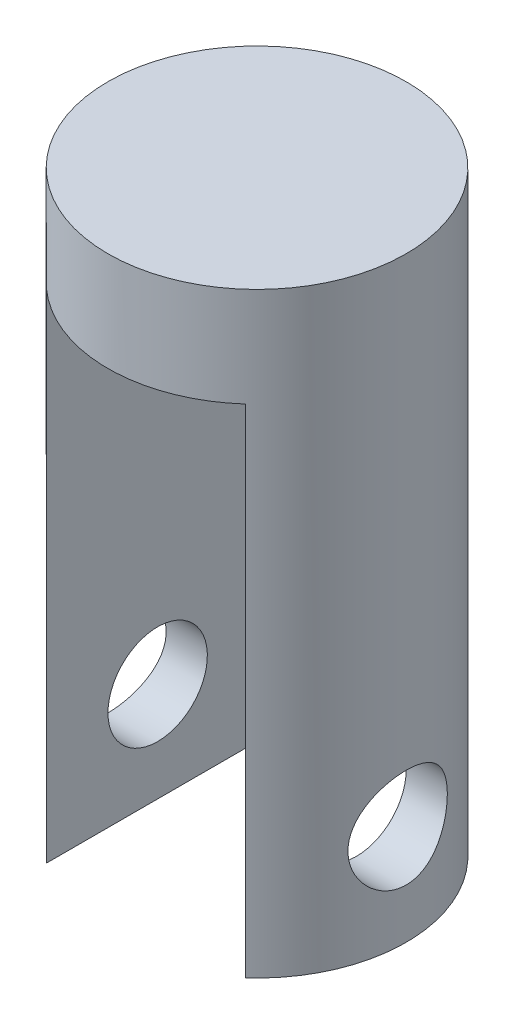
ISO-10303-21;
HEADER;
FILE_DESCRIPTION(('STEP AP214'),'2;1');
FILE_NAME('part.step','',(''),(''),'','','');
FILE_SCHEMA(('AUTOMOTIVE_DESIGN { 1 0 10303 214 1 1 1 1 }'));
ENDSEC;
DATA;
#1=APPLICATION_CONTEXT('core data for automotive mechanical design processes');
#2=APPLICATION_PROTOCOL_DEFINITION('international standard','automotive_design',2000,#1);
#3=PRODUCT_CONTEXT('',#1,'mechanical');
#4=PRODUCT('Part','Part','',(#3));
#5=PRODUCT_RELATED_PRODUCT_CATEGORY('part','',(#4));
#6=PRODUCT_DEFINITION_FORMATION('','',#4);
#7=PRODUCT_DEFINITION_CONTEXT('part definition',#1,'design');
#8=PRODUCT_DEFINITION('design','',#6,#7);
#9=PRODUCT_DEFINITION_SHAPE('','',#8);
#10=(LENGTH_UNIT() NAMED_UNIT(*) SI_UNIT(.MILLI.,.METRE.));
#11=(NAMED_UNIT(*) PLANE_ANGLE_UNIT() SI_UNIT($,.RADIAN.));
#12=(NAMED_UNIT(*) SI_UNIT($,.STERADIAN.) SOLID_ANGLE_UNIT());
#13=UNCERTAINTY_MEASURE_WITH_UNIT(LENGTH_MEASURE(1.E-05),#10,'distance_accuracy_value','');
#14=(GEOMETRIC_REPRESENTATION_CONTEXT(3) GLOBAL_UNCERTAINTY_ASSIGNED_CONTEXT((#13)) GLOBAL_UNIT_ASSIGNED_CONTEXT((#10,
#11,#12)) REPRESENTATION_CONTEXT('',''));
#15=CARTESIAN_POINT('',(0.,0.,0.));
#16=DIRECTION('',(0.,0.,1.));
#17=DIRECTION('',(1.,0.,0.));
#18=AXIS2_PLACEMENT_3D('',#15,#16,#17);
#19=CARTESIAN_POINT('',(0.,-50.,0.));
#20=DIRECTION('',(0.,1.,0.));
#21=DIRECTION('',(0.,0.,1.));
#22=AXIS2_PLACEMENT_3D('',#19,#20,#21);
#23=PLANE('',#22);
#24=CARTESIAN_POINT('',(0.,-50.,0.));
#25=DIRECTION('',(0.,1.,0.));
#26=DIRECTION('',(0.,0.,1.));
#27=AXIS2_PLACEMENT_3D('',#24,#25,#26);
#28=CIRCLE('',#27,15.);
#29=CARTESIAN_POINT('',(-10.,-50.,-11.180339887499));
#30=VERTEX_POINT('',#29);
#31=CARTESIAN_POINT('',(-10.,-50.,11.1803398874989));
#32=VERTEX_POINT('',#31);
#33=EDGE_CURVE('E115',#30,#32,#28,.T.);
#34=ORIENTED_EDGE('',*,*,#33,.F.);
#35=DIRECTION('',(0.,0.,1.));
#36=VECTOR('',#35,1.);
#37=CARTESIAN_POINT('',(-10.,-50.,0.));
#38=LINE('',#37,#36);
#39=EDGE_CURVE('E123',#30,#32,#38,.T.);
#40=ORIENTED_EDGE('',*,*,#39,.T.);
#41=EDGE_LOOP('',(#34,#40));
#42=FACE_BOUND('',#41,.T.);
#43=ADVANCED_FACE('F51',(#42),#23,.F.);
#44=CARTESIAN_POINT('',(0.,10.,0.));
#45=DIRECTION('',(0.,-1.,0.));
#46=DIRECTION('',(0.,0.,-1.));
#47=AXIS2_PLACEMENT_3D('',#44,#45,#46);
#48=CYLINDRICAL_SURFACE('',#47,15.);
#49=CARTESIAN_POINT('',(-15.,-45.,0.));
#50=CARTESIAN_POINT('',(-15.0000007650471,-45.0000012686582,-0.272816814433608));
#51=CARTESIAN_POINT('',(-14.9924884753769,-44.977598669364,-0.545625972692719));
#52=CARTESIAN_POINT('',(-14.9632605101644,-44.8888544559139,-1.08320880436489));
#53=CARTESIAN_POINT('',(-14.941543360109,-44.8225082802552,-1.3479816405942));
#54=CARTESIAN_POINT('',(-14.8862653953208,-44.6484037830799,-1.86166394750877));
#55=CARTESIAN_POINT('',(-14.8527243865377,-44.5407146877042,-2.11059912942976));
#56=CARTESIAN_POINT('',(-14.7772222858721,-44.2872941358077,-2.58687468402704));
#57=CARTESIAN_POINT('',(-14.7352595334076,-44.1415551749849,-2.81421078479507));
#58=CARTESIAN_POINT('',(-14.6457047221309,-43.8108709757084,-3.24870837510974));
#59=CARTESIAN_POINT('',(-14.5979778231161,-43.6248438287057,-3.45501850148552));
#60=CARTESIAN_POINT('',(-14.5030157392292,-43.221164226459,-3.83416346351645));
#61=CARTESIAN_POINT('',(-14.4557806648007,-43.0035048253269,-4.00699092746984));
#62=CARTESIAN_POINT('',(-14.3656666235818,-42.5350744240449,-4.31912471111899));
#63=CARTESIAN_POINT('',(-14.3229519627198,-42.2835313014492,-4.45732429102252));
#64=CARTESIAN_POINT('',(-14.2487652698844,-41.7591195278211,-4.68909436930558));
#65=CARTESIAN_POINT('',(-14.2172898077928,-41.4862574142214,-4.78267848691248));
#66=CARTESIAN_POINT('',(-14.1705651637056,-40.9366338924888,-4.91936730756489));
#67=CARTESIAN_POINT('',(-14.1548047884338,-40.6603139575403,-4.96406724136037));
#68=CARTESIAN_POINT('',(-14.1397828315221,-40.103681229235,-5.00670561667088));
#69=CARTESIAN_POINT('',(-14.1405161515599,-39.8233696964841,-5.00465850803659));
#70=CARTESIAN_POINT('',(-14.1579507500054,-39.2803168477389,-4.95509951850357));
#71=CARTESIAN_POINT('',(-14.1739207918415,-39.0173579852815,-4.90966956578089));
#72=CARTESIAN_POINT('',(-14.2188328846856,-38.5030329018494,-4.77803081419368));
#73=CARTESIAN_POINT('',(-14.2477764887883,-38.2516680727977,-4.6918171329474));
#74=CARTESIAN_POINT('',(-14.3158955569848,-37.7629362520803,-4.4796952903177));
#75=CARTESIAN_POINT('',(-14.3552282897692,-37.5258598726625,-4.35317024354079));
#76=CARTESIAN_POINT('',(-14.4396279286729,-37.0756454585912,-4.06444553151124));
#77=CARTESIAN_POINT('',(-14.4846964894921,-36.8625143653303,-3.90223556181881));
#78=CARTESIAN_POINT('',(-14.5783664584198,-36.4545420091991,-3.53674666341248));
#79=CARTESIAN_POINT('',(-14.6270294677509,-36.2612365274554,-3.33176575038191));
#80=CARTESIAN_POINT('',(-14.7203469193431,-35.9113436666822,-2.89169784984998));
#81=CARTESIAN_POINT('',(-14.765000976901,-35.7547598091773,-2.65660797830399));
#82=CARTESIAN_POINT('',(-14.8458553968921,-35.4815184988249,-2.15973806523145));
#83=CARTESIAN_POINT('',(-14.8819675004026,-35.3652725432964,-1.89771638208172));
#84=CARTESIAN_POINT('',(-14.9410283572211,-35.1789841302214,-1.35634541682253));
#85=CARTESIAN_POINT('',(-14.9639816827438,-35.1089256228828,-1.07700219077478));
#86=CARTESIAN_POINT('',(-14.9933813535722,-35.0197216698882,-0.52191914764654));
#87=CARTESIAN_POINT('',(-15.0005000916864,-34.9985009541362,-0.246547999324246));
#88=CARTESIAN_POINT('',(-14.9994451347413,-35.0016633679923,0.303875349801176));
#89=CARTESIAN_POINT('',(-14.9912740209681,-35.0260387998994,0.57892759659824));
#90=CARTESIAN_POINT('',(-14.9610012358552,-35.1180595386798,1.11259933152126));
#91=CARTESIAN_POINT('',(-14.9393099355596,-35.1844310302475,1.3714640341742));
#92=CARTESIAN_POINT('',(-14.8845923415035,-35.3569672223336,1.87427979289785));
#93=CARTESIAN_POINT('',(-14.8515646023338,-35.4631369973389,2.11822894254302));
#94=CARTESIAN_POINT('',(-14.7764465643645,-35.7153521592039,2.59144148196635));
#95=CARTESIAN_POINT('',(-14.7341407377893,-35.8623729664159,2.82014979608572));
#96=CARTESIAN_POINT('',(-14.6452626958131,-36.1909707500674,3.25032415067792));
#97=CARTESIAN_POINT('',(-14.5986891796914,-36.3725582801588,3.45178183897787));
#98=CARTESIAN_POINT('',(-14.5038423990222,-36.7748937550329,3.83126253903149));
#99=CARTESIAN_POINT('',(-14.4555880543714,-36.9970461346343,4.00780484622885));
#100=CARTESIAN_POINT('',(-14.3649986647354,-37.4688578390544,4.32128761161787));
#101=CARTESIAN_POINT('',(-14.3226636691001,-37.7185173931704,4.45822773965506));
#102=CARTESIAN_POINT('',(-14.2491195895692,-38.2383650764495,4.6879846520818));
#103=CARTESIAN_POINT('',(-14.2178880396489,-38.5085103958438,4.7808906608251));
#104=CARTESIAN_POINT('',(-14.1705416153225,-39.0618932502206,4.91947333379677));
#105=CARTESIAN_POINT('',(-14.154419931182,-39.3451248270217,4.96517127476969));
#106=CARTESIAN_POINT('',(-14.1398929437089,-39.9009854802046,5.0063814123867));
#107=CARTESIAN_POINT('',(-14.1406200128708,-40.1734117014341,5.00435128654199));
#108=CARTESIAN_POINT('',(-14.1575634911934,-40.7138253746103,4.95621146724346));
#109=CARTESIAN_POINT('',(-14.1737789784681,-40.9818130897754,4.91010439729292));
#110=CARTESIAN_POINT('',(-14.2192262152446,-41.5006783150124,4.77685906564672));
#111=CARTESIAN_POINT('',(-14.2482049011239,-41.7517841250225,4.69051673007757));
#112=CARTESIAN_POINT('',(-14.3158199409234,-42.2361370346913,4.47989682879873));
#113=CARTESIAN_POINT('',(-14.3544584381697,-42.46938015594,4.35561084276903));
#114=CARTESIAN_POINT('',(-14.4391414613023,-42.9224183496146,4.06630346291715));
#115=CARTESIAN_POINT('',(-14.4854355821069,-43.1411825094919,3.8997412138229));
#116=CARTESIAN_POINT('',(-14.5791678141626,-43.548449066921,3.53321441567824));
#117=CARTESIAN_POINT('',(-14.6266062456186,-43.7369428784404,3.33324042225741));
#118=CARTESIAN_POINT('',(-14.7195015262772,-44.0857220614459,2.89620778460344));
#119=CARTESIAN_POINT('',(-14.7648090900628,-44.244621738755,2.65800756749864));
#120=CARTESIAN_POINT('',(-14.8462995586306,-44.5199521442532,2.15678678703313));
#121=CARTESIAN_POINT('',(-14.8824847953965,-44.6363937296102,1.89377259066175));
#122=CARTESIAN_POINT('',(-14.9402757534271,-44.8186081624434,1.36246823600488));
#123=CARTESIAN_POINT('',(-14.9624606211261,-44.8864123313169,1.09493878838205));
#124=CARTESIAN_POINT('',(-14.9923203532111,-44.9771014033856,0.551602080051236));
#125=CARTESIAN_POINT('',(-14.9999992265953,-44.9999987174827,0.275797127843725));
#126=CARTESIAN_POINT('',(-15.,-45.,0.));
#127=B_SPLINE_CURVE_WITH_KNOTS('',3,(#49,#50,#51,#52,#53,#54,#55,#56,#57,#58,#59,#60,#61,#62,
#63,#64,#65,#66,#67,#68,#69,#70,#71,#72,#73,#74,#75,#76,#77,#78,#79,#80,#81,#82,#83,#84,#85,#86,
#87,#88,#89,#90,#91,#92,#93,#94,#95,#96,#97,#98,#99,#100,#101,#102,#103,#104,#105,#106,#107,
#108,#109,#110,#111,#112,#113,#114,#115,#116,#117,#118,#119,#120,#121,#122,#123,#124,#125,#126),
.UNSPECIFIED.,.T.,.F.,(4,2,2,2,2,2,2,2,2,2,2,2,2,2,2,2,2,2,2,2,2,2,2,2,2,2,2,2,2,2,2,2,2,2,2,2,
2,2,4),(0.,0.817435530130053,1.6349559263376,2.45111336435137,3.2674318889955,4.10923421413779,
4.95122166437651,5.8174192411892,6.6833522346775,7.52009628712783,8.3565816994101,
9.15484132763712,9.95319654288061,10.764408557863,11.5758551280169,12.4296652906749,
13.2835572984374,14.1459202826244,15.0079834439669,15.832679158865,16.6572356583153,
17.4579078990172,18.2586822643117,19.0805199922933,19.9026090412011,20.7620511441441,
21.6215004118563,22.479200691445,23.3365142353985,24.1497833033194,24.9630039676753,
25.7607793541274,26.5587319089054,27.3915033346967,28.2245105562954,29.0899830418615,
29.9552340577293,30.7818279187972,31.6081933020135),.UNSPECIFIED.);
#128=CARTESIAN_POINT('',(-15.,-45.,0.));
#129=VERTEX_POINT('',#128);
#130=EDGE_CURVE('E101',#129,#129,#127,.T.);
#131=ORIENTED_EDGE('',*,*,#130,.T.);
#132=EDGE_LOOP('',(#131));
#133=FACE_BOUND('',#132,.T.);
#134=CARTESIAN_POINT('',(14.142135623731,-40.,-5.00000000000001));
#135=CARTESIAN_POINT('',(14.1421347265217,-40.2723408741804,-5.00000128973857));
#136=CARTESIAN_POINT('',(14.1500884645429,-40.544673999118,-4.97767391842762));
#137=CARTESIAN_POINT('',(14.1808787040627,-41.0812721049712,-4.88925565844405));
#138=CARTESIAN_POINT('',(14.2037176571094,-41.3455357493623,-4.82315756084199));
#139=CARTESIAN_POINT('',(14.2614101844396,-41.8581344649864,-4.64977742842453));
#140=CARTESIAN_POINT('',(14.2962401985661,-42.1064996472136,-4.54257610701623));
#141=CARTESIAN_POINT('',(14.3739561005162,-42.5818002427398,-4.29030814220691));
#142=CARTESIAN_POINT('',(14.4168437651806,-42.8087309127682,-4.14523314430092));
#143=CARTESIAN_POINT('',(14.5077244703737,-43.2435998116916,-3.8152557322144));
#144=CARTESIAN_POINT('',(14.5558447422322,-43.4505771433586,-3.62912170688961));
#145=CARTESIAN_POINT('',(14.6506932400501,-43.8310340061232,-3.22493833607199));
#146=CARTESIAN_POINT('',(14.6974212414481,-44.0045081579119,-3.00688387526189));
#147=CARTESIAN_POINT('',(14.7856933460899,-44.317394486648,-2.53802253982506));
#148=CARTESIAN_POINT('',(14.8270703850803,-44.4557998530898,-2.28650955612264));
#149=CARTESIAN_POINT('',(14.8984793385491,-44.6879579256376,-1.76215611493738));
#150=CARTESIAN_POINT('',(14.9285143101501,-44.7817226658845,-1.48932142843607));
#151=CARTESIAN_POINT('',(14.9729537715953,-44.918679273162,-0.940144087167483));
#152=CARTESIAN_POINT('',(14.987865738878,-44.963517231285,-0.664253774264854));
#153=CARTESIAN_POINT('',(15.0021804109124,-45.0065814668033,-0.108489374120458));
#154=CARTESIAN_POINT('',(15.0015871131448,-45.0048197582621,0.171383667719471));
#155=CARTESIAN_POINT('',(14.9853019809366,-44.9557787271699,0.715517575969064));
#156=CARTESIAN_POINT('',(14.9702032377559,-44.9102873576276,0.979960242958274));
#157=CARTESIAN_POINT('',(14.9273483669866,-44.7780350950976,1.49721719411085));
#158=CARTESIAN_POINT('',(14.8995913815591,-44.6912714051009,1.75003068889607));
#159=CARTESIAN_POINT('',(14.8337835146612,-44.4778934134697,2.24076237420985));
#160=CARTESIAN_POINT('',(14.7956021262008,-44.3507703072674,2.47844110484422));
#161=CARTESIAN_POINT('',(14.712919651946,-44.0607014727567,2.9296216276366));
#162=CARTESIAN_POINT('',(14.6684168100733,-43.8977457833618,3.1431166719267));
#163=CARTESIAN_POINT('',(14.5753095924948,-43.5316280327015,3.55050433275653));
#164=CARTESIAN_POINT('',(14.5266107584439,-43.3269342107926,3.74300078532635));
#165=CARTESIAN_POINT('',(14.432366762445,-42.8877563713669,4.09138629799086));
#166=CARTESIAN_POINT('',(14.3868220872808,-42.6532677713598,4.24726971640771));
#167=CARTESIAN_POINT('',(14.3035262560556,-42.1567318719828,4.51993727517871));
#168=CARTESIAN_POINT('',(14.2658954642374,-41.8943393434111,4.63613231810669));
#169=CARTESIAN_POINT('',(14.2040825412192,-41.3521430289279,4.82221596634668));
#170=CARTESIAN_POINT('',(14.1798947743546,-41.0723465939688,4.89212397873746));
#171=CARTESIAN_POINT('',(14.1489818157793,-40.5168082229421,4.9808064104876));
#172=CARTESIAN_POINT('',(14.1415180159378,-40.2414528762567,5.00174547753816));
#173=CARTESIAN_POINT('',(14.1428336029592,-39.6911192544295,4.99802719454859));
#174=CARTESIAN_POINT('',(14.1516100395907,-39.4161409198801,4.97337812613381));
#175=CARTESIAN_POINT('',(14.183680904515,-38.8842151714405,4.88112825776155));
#176=CARTESIAN_POINT('',(14.206466272042,-38.6269728492458,4.81503196990341));
#177=CARTESIAN_POINT('',(14.2634276835512,-38.1272819688041,4.64356931280233));
#178=CARTESIAN_POINT('',(14.297605746742,-37.8848360420461,4.53819598181711));
#179=CARTESIAN_POINT('',(14.3748438797893,-37.413097895765,4.28737170369468));
#180=CARTESIAN_POINT('',(14.4181512832814,-37.184466786791,4.14075559179248));
#181=CARTESIAN_POINT('',(14.5082884365483,-36.7542697380814,3.81292815278779));
#182=CARTESIAN_POINT('',(14.5551192221897,-36.5527118066939,3.63170662749391));
#183=CARTESIAN_POINT('',(14.6497519318925,-36.1723600795468,3.22945852950163));
#184=CARTESIAN_POINT('',(14.6974921788948,-35.9951280499058,3.00693635273326));
#185=CARTESIAN_POINT('',(14.7863425806554,-35.6804192882598,2.53413645700128));
#186=CARTESIAN_POINT('',(14.8274529708847,-35.5429411441879,2.28385972432276));
#187=CARTESIAN_POINT('',(14.8982202905301,-35.3128994756914,1.76389931216148));
#188=CARTESIAN_POINT('',(14.9279515002266,-35.2200436142597,1.49435561660598));
#189=CARTESIAN_POINT('',(14.9729305418887,-35.0813612896995,0.942292329230082));
#190=CARTESIAN_POINT('',(14.9881836017009,-35.0355178505975,0.659777459769448));
#191=CARTESIAN_POINT('',(15.0020931618128,-34.9936896119718,0.104076679300205));
#192=CARTESIAN_POINT('',(15.001496004472,-34.9954627303381,-0.168923619600093));
#193=CARTESIAN_POINT('',(14.9856098259699,-35.043286540732,-0.710555725000871));
#194=CARTESIAN_POINT('',(14.9703219966788,-35.0893336407638,-0.979187884095286));
#195=CARTESIAN_POINT('',(14.9270457477206,-35.2229111728798,-1.5002105971603));
#196=CARTESIAN_POINT('',(14.8992629180574,-35.3097710767647,-1.75279135456395));
#197=CARTESIAN_POINT('',(14.8338580352247,-35.5218876554858,-2.23989175469898));
#198=CARTESIAN_POINT('',(14.7962342024008,-35.6471512759851,-2.47440812071216));
#199=CARTESIAN_POINT('',(14.713293441394,-35.93784756051,-2.92817008154393));
#200=CARTESIAN_POINT('',(14.6677436245963,-36.1045934269082,-3.14653125778804));
#201=CARTESIAN_POINT('',(14.574649439594,-36.471286955781,-3.55290513136214));
#202=CARTESIAN_POINT('',(14.5271044386549,-36.6712452113136,-3.74090810812297));
#203=CARTESIAN_POINT('',(14.4331639912799,-37.1080467779347,-4.08870904416559));
#204=CARTESIAN_POINT('',(14.3868863994315,-37.3460275548832,-4.24711482998951));
#205=CARTESIAN_POINT('',(14.3030096661508,-37.8466721345139,-4.52157171650558));
#206=CARTESIAN_POINT('',(14.2654082580625,-38.1093294651483,-4.63763388409738));
#207=CARTESIAN_POINT('',(14.2050667103257,-38.6398091200782,-4.81921914102083));
#208=CARTESIAN_POINT('',(14.1817316428591,-38.9068613176268,-4.8867895457476));
#209=CARTESIAN_POINT('',(14.1502691769759,-39.4492802523335,-4.97717160074634));
#210=CARTESIAN_POINT('',(14.1421365308731,-39.7246440870535,-4.99999869598297));
#211=CARTESIAN_POINT('',(14.142135623731,-40.,-5.00000000000001));
#212=B_SPLINE_CURVE_WITH_KNOTS('',3,(#134,#135,#136,#137,#138,#139,#140,#141,#142,#143,#144,
#145,#146,#147,#148,#149,#150,#151,#152,#153,#154,#155,#156,#157,#158,#159,#160,#161,#162,#163,
#164,#165,#166,#167,#168,#169,#170,#171,#172,#173,#174,#175,#176,#177,#178,#179,#180,#181,#182,
#183,#184,#185,#186,#187,#188,#189,#190,#191,#192,#193,#194,#195,#196,#197,#198,#199,#200,#201,
#202,#203,#204,#205,#206,#207,#208,#209,#210,#211),.UNSPECIFIED.,.T.,.F.,(4,2,2,2,2,2,2,2,2,2,2,
2,2,2,2,2,2,2,2,2,2,2,2,2,2,2,2,2,2,2,2,2,2,2,2,2,2,2,4),(0.,0.816002923996773,1.63214027507581,
2.44668313750414,3.26140583092721,4.1050668713784,4.94886325859939,5.81467530718285,
6.68025381933945,7.51571593824671,8.35096266511636,9.15345024127845,9.95599220946183,
10.7690827430167,11.5823995937011,12.4340087181959,13.2857489806053,14.1496319921528,
15.0131525678308,15.837714568222,16.6621267918617,17.4582197884388,18.2544539573473,
19.0759428867857,19.8976742831064,20.7589404085546,21.6201759378766,22.4756895595426,
23.3308941502078,24.1459042338818,24.960848200489,25.7628478020215,26.5649925381621,
27.3967759760317,28.2288252216316,29.0934451368072,29.9578389133433,30.7831606081345,
31.6081973595232),.UNSPECIFIED.);
#213=CARTESIAN_POINT('',(14.142135623731,-40.,-5.00000000000001));
#214=VERTEX_POINT('',#213);
#215=EDGE_CURVE('E217',#214,#214,#212,.T.);
#216=ORIENTED_EDGE('',*,*,#215,.T.);
#217=EDGE_LOOP('',(#216));
#218=FACE_BOUND('',#217,.T.);
#219=CARTESIAN_POINT('',(0.,10.,0.));
#220=DIRECTION('',(0.,1.,0.));
#221=DIRECTION('',(0.,0.,1.));
#222=AXIS2_PLACEMENT_3D('',#219,#220,#221);
#223=CIRCLE('',#222,15.);
#224=CARTESIAN_POINT('',(0.,10.,15.));
#225=VERTEX_POINT('',#224);
#226=EDGE_CURVE('E118',#225,#225,#223,.T.);
#227=ORIENTED_EDGE('',*,*,#226,.F.);
#228=EDGE_LOOP('',(#227));
#229=FACE_BOUND('',#228,.T.);
#230=CARTESIAN_POINT('',(0.,0.,0.));
#231=DIRECTION('',(0.,1.,0.));
#232=DIRECTION('',(0.,0.,1.));
#233=AXIS2_PLACEMENT_3D('',#230,#231,#232);
#234=CIRCLE('',#233,15.);
#235=CARTESIAN_POINT('',(-10.,0.,11.180339887499));
#236=VERTEX_POINT('',#235);
#237=CARTESIAN_POINT('',(10.,0.,11.1803398874989));
#238=VERTEX_POINT('',#237);
#239=EDGE_CURVE('E61',#236,#238,#234,.T.);
#240=ORIENTED_EDGE('',*,*,#239,.T.);
#241=DIRECTION('',(0.,-1.,0.));
#242=VECTOR('',#241,1.);
#243=CARTESIAN_POINT('',(10.,10.,11.180339887499));
#244=LINE('',#243,#242);
#245=CARTESIAN_POINT('',(10.,-50.,11.1803398874989));
#246=VERTEX_POINT('',#245);
#247=EDGE_CURVE('E100',#238,#246,#244,.T.);
#248=ORIENTED_EDGE('',*,*,#247,.T.);
#249=CARTESIAN_POINT('',(10.,-50.,-11.180339887499));
#250=VERTEX_POINT('',#249);
#251=EDGE_CURVE('E105',#246,#250,#28,.T.);
#252=ORIENTED_EDGE('',*,*,#251,.T.);
#253=DIRECTION('',(0.,-1.,0.));
#254=VECTOR('',#253,1.);
#255=CARTESIAN_POINT('',(10.,10.,-11.180339887499));
#256=LINE('',#255,#254);
#257=CARTESIAN_POINT('',(10.,0.,-11.180339887499));
#258=VERTEX_POINT('',#257);
#259=EDGE_CURVE('E68',#250,#258,#256,.F.);
#260=ORIENTED_EDGE('',*,*,#259,.T.);
#261=CARTESIAN_POINT('',(-10.,0.,-11.180339887499));
#262=VERTEX_POINT('',#261);
#263=EDGE_CURVE('E13',#258,#262,#234,.T.);
#264=ORIENTED_EDGE('',*,*,#263,.T.);
#265=DIRECTION('',(0.,-1.,0.));
#266=VECTOR('',#265,1.);
#267=CARTESIAN_POINT('',(-10.,10.,-11.180339887499));
#268=LINE('',#267,#266);
#269=EDGE_CURVE('E113',#262,#30,#268,.T.);
#270=ORIENTED_EDGE('',*,*,#269,.T.);
#271=ORIENTED_EDGE('',*,*,#33,.T.);
#272=DIRECTION('',(0.,-1.,0.));
#273=VECTOR('',#272,1.);
#274=CARTESIAN_POINT('',(-10.,10.,11.180339887499));
#275=LINE('',#274,#273);
#276=EDGE_CURVE('E107',#32,#236,#275,.F.);
#277=ORIENTED_EDGE('',*,*,#276,.T.);
#278=EDGE_LOOP('',(#240,#248,#252,#260,#264,#270,#271,#277));
#279=FACE_BOUND('',#278,.T.);
#280=ADVANCED_FACE('F53',(#133,#218,#229,#279),#48,.T.);
#281=CARTESIAN_POINT('',(0.,10.,0.));
#282=DIRECTION('',(0.,1.,0.));
#283=DIRECTION('',(0.,0.,1.));
#284=AXIS2_PLACEMENT_3D('',#281,#282,#283);
#285=PLANE('',#284);
#286=ORIENTED_EDGE('',*,*,#226,.T.);
#287=EDGE_LOOP('',(#286));
#288=FACE_BOUND('',#287,.T.);
#289=ADVANCED_FACE('F137',(#288),#285,.T.);
#290=ORIENTED_EDGE('',*,*,#251,.F.);
#291=DIRECTION('',(0.,0.,-1.));
#292=VECTOR('',#291,1.);
#293=CARTESIAN_POINT('',(10.,-50.,0.));
#294=LINE('',#293,#292);
#295=EDGE_CURVE('E121',#246,#250,#294,.T.);
#296=ORIENTED_EDGE('',*,*,#295,.T.);
#297=EDGE_LOOP('',(#290,#296));
#298=FACE_BOUND('',#297,.T.);
#299=ADVANCED_FACE('F131',(#298),#23,.F.);
#300=CARTESIAN_POINT('',(-10.,0.,-15.));
#301=DIRECTION('',(0.,1.,0.));
#302=DIRECTION('',(0.,0.,1.));
#303=AXIS2_PLACEMENT_3D('',#300,#301,#302);
#304=PLANE('',#303);
#305=DIRECTION('',(0.,0.,1.));
#306=VECTOR('',#305,1.);
#307=CARTESIAN_POINT('',(10.,0.,-15.));
#308=LINE('',#307,#306);
#309=EDGE_CURVE('E93',#258,#238,#308,.T.);
#310=ORIENTED_EDGE('',*,*,#309,.T.);
#311=ORIENTED_EDGE('',*,*,#239,.F.);
#312=DIRECTION('',(0.,0.,1.));
#313=VECTOR('',#312,1.);
#314=CARTESIAN_POINT('',(-10.,0.,-15.));
#315=LINE('',#314,#313);
#316=EDGE_CURVE('E94',#262,#236,#315,.T.);
#317=ORIENTED_EDGE('',*,*,#316,.F.);
#318=ORIENTED_EDGE('',*,*,#263,.F.);
#319=EDGE_LOOP('',(#310,#311,#317,#318));
#320=FACE_BOUND('',#319,.T.);
#321=ADVANCED_FACE('F92',(#320),#304,.F.);
#322=CARTESIAN_POINT('',(-10.,-50.,-15.));
#323=DIRECTION('',(-1.,0.,0.));
#324=DIRECTION('',(0.,0.,1.));
#325=AXIS2_PLACEMENT_3D('',#322,#323,#324);
#326=PLANE('',#325);
#327=CARTESIAN_POINT('',(-10.,-40.,0.));
#328=DIRECTION('',(-1.,0.,0.));
#329=DIRECTION('',(0.,0.,1.));
#330=AXIS2_PLACEMENT_3D('',#327,#328,#329);
#331=CIRCLE('',#330,5.);
#332=CARTESIAN_POINT('',(-10.,-40.,4.99999999999999));
#333=VERTEX_POINT('',#332);
#334=EDGE_CURVE('E229',#333,#333,#331,.T.);
#335=ORIENTED_EDGE('',*,*,#334,.T.);
#336=EDGE_LOOP('',(#335));
#337=FACE_BOUND('',#336,.T.);
#338=ORIENTED_EDGE('',*,*,#316,.T.);
#339=ORIENTED_EDGE('',*,*,#276,.F.);
#340=ORIENTED_EDGE('',*,*,#39,.F.);
#341=ORIENTED_EDGE('',*,*,#269,.F.);
#342=EDGE_LOOP('',(#338,#339,#340,#341));
#343=FACE_BOUND('',#342,.T.);
#344=ADVANCED_FACE('F127',(#337,#343),#326,.F.);
#345=CARTESIAN_POINT('',(10.,-50.,-15.));
#346=DIRECTION('',(1.,0.,0.));
#347=DIRECTION('',(0.,0.,-1.));
#348=AXIS2_PLACEMENT_3D('',#345,#346,#347);
#349=PLANE('',#348);
#350=CARTESIAN_POINT('',(10.,-40.,0.));
#351=DIRECTION('',(1.,0.,0.));
#352=DIRECTION('',(0.,0.,-1.));
#353=AXIS2_PLACEMENT_3D('',#350,#351,#352);
#354=CIRCLE('',#353,5.);
#355=CARTESIAN_POINT('',(10.,-40.,-5.00000000000001));
#356=VERTEX_POINT('',#355);
#357=EDGE_CURVE('E56',#356,#356,#354,.T.);
#358=ORIENTED_EDGE('',*,*,#357,.T.);
#359=EDGE_LOOP('',(#358));
#360=FACE_BOUND('',#359,.T.);
#361=ORIENTED_EDGE('',*,*,#309,.F.);
#362=ORIENTED_EDGE('',*,*,#259,.F.);
#363=ORIENTED_EDGE('',*,*,#295,.F.);
#364=ORIENTED_EDGE('',*,*,#247,.F.);
#365=EDGE_LOOP('',(#361,#362,#363,#364));
#366=FACE_BOUND('',#365,.T.);
#367=ADVANCED_FACE('F98',(#360,#366),#349,.F.);
#368=CARTESIAN_POINT('',(-15.,-40.,0.));
#369=DIRECTION('',(1.,0.,0.));
#370=DIRECTION('',(0.,0.,-1.));
#371=AXIS2_PLACEMENT_3D('',#368,#369,#370);
#372=CYLINDRICAL_SURFACE('',#371,5.);
#373=ORIENTED_EDGE('',*,*,#357,.F.);
#374=EDGE_LOOP('',(#373));
#375=FACE_BOUND('',#374,.T.);
#376=ORIENTED_EDGE('',*,*,#215,.F.);
#377=EDGE_LOOP('',(#376));
#378=FACE_BOUND('',#377,.T.);
#379=ADVANCED_FACE('F190',(#375,#378),#372,.F.);
#380=ORIENTED_EDGE('',*,*,#334,.F.);
#381=EDGE_LOOP('',(#380));
#382=FACE_BOUND('',#381,.T.);
#383=ORIENTED_EDGE('',*,*,#130,.F.);
#384=EDGE_LOOP('',(#383));
#385=FACE_BOUND('',#384,.T.);
#386=ADVANCED_FACE('F200',(#382,#385),#372,.F.);
#387=CLOSED_SHELL('',(#43,#280,#289,#299,#321,#344,#367,#379,#386));
#388=MANIFOLD_SOLID_BREP('B2',#387);
#389=ADVANCED_BREP_SHAPE_REPRESENTATION('',(#18,#388),#14);
#390=SHAPE_DEFINITION_REPRESENTATION(#9,#389);
ENDSEC;
END-ISO-10303-21;
